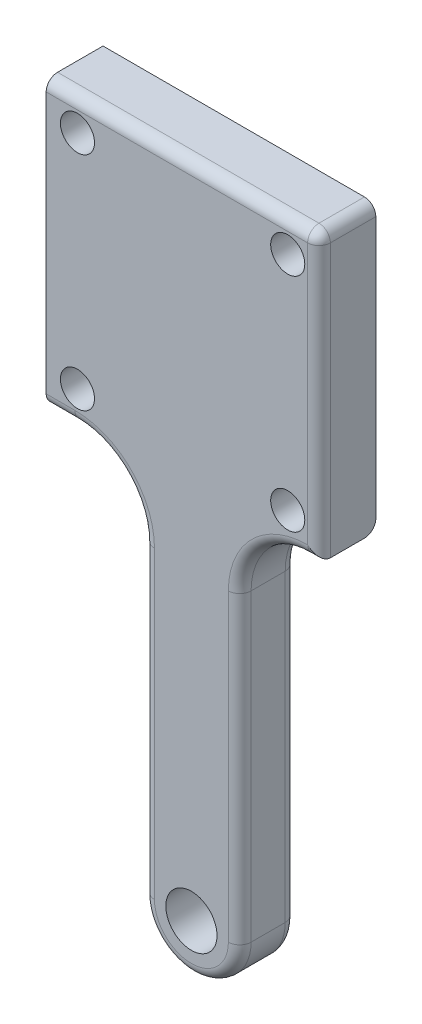
ISO-10303-21;
HEADER;
FILE_DESCRIPTION(('STEP AP214'),'2;1');
FILE_NAME('part.step','',(''),(''),'','','');
FILE_SCHEMA(('AUTOMOTIVE_DESIGN { 1 0 10303 214 1 1 1 1 }'));
ENDSEC;
DATA;
#1=APPLICATION_CONTEXT('core data for automotive mechanical design processes');
#2=APPLICATION_PROTOCOL_DEFINITION('international standard','automotive_design',2000,#1);
#3=PRODUCT_CONTEXT('',#1,'mechanical');
#4=PRODUCT('Part','Part','',(#3));
#5=PRODUCT_RELATED_PRODUCT_CATEGORY('part','',(#4));
#6=PRODUCT_DEFINITION_FORMATION('','',#4);
#7=PRODUCT_DEFINITION_CONTEXT('part definition',#1,'design');
#8=PRODUCT_DEFINITION('design','',#6,#7);
#9=PRODUCT_DEFINITION_SHAPE('','',#8);
#10=(LENGTH_UNIT() NAMED_UNIT(*) SI_UNIT(.MILLI.,.METRE.));
#11=(NAMED_UNIT(*) PLANE_ANGLE_UNIT() SI_UNIT($,.RADIAN.));
#12=(NAMED_UNIT(*) SI_UNIT($,.STERADIAN.) SOLID_ANGLE_UNIT());
#13=UNCERTAINTY_MEASURE_WITH_UNIT(LENGTH_MEASURE(1.E-05),#10,'distance_accuracy_value','');
#14=(GEOMETRIC_REPRESENTATION_CONTEXT(3) GLOBAL_UNCERTAINTY_ASSIGNED_CONTEXT((#13)) GLOBAL_UNIT_ASSIGNED_CONTEXT((#10,
#11,#12)) REPRESENTATION_CONTEXT('',''));
#15=CARTESIAN_POINT('',(0.,0.,0.));
#16=DIRECTION('',(0.,0.,1.));
#17=DIRECTION('',(1.,0.,0.));
#18=AXIS2_PLACEMENT_3D('',#15,#16,#17);
#19=CARTESIAN_POINT('',(20.9277611445584,10.0126169361447,5.));
#20=DIRECTION('',(0.,0.,-1.));
#21=DIRECTION('',(-1.,0.,0.));
#22=AXIS2_PLACEMENT_3D('',#19,#20,#21);
#23=PLANE('',#22);
#24=DIRECTION('',(0.,1.,0.));
#25=VECTOR('',#24,1.);
#26=CARTESIAN_POINT('',(20.8999999999998,10.0126169361447,5.));
#27=LINE('',#26,#25);
#28=CARTESIAN_POINT('',(20.8999999999998,17.0125618872748,5.));
#29=VERTEX_POINT('',#28);
#30=CARTESIAN_POINT('',(20.8999999999998,40.0126169361447,5.));
#31=VERTEX_POINT('',#30);
#32=EDGE_CURVE('E188',#29,#31,#27,.T.);
#33=ORIENTED_EDGE('',*,*,#32,.T.);
#34=DIRECTION('',(-1.,0.,0.));
#35=VECTOR('',#34,1.);
#36=CARTESIAN_POINT('',(20.9277611445584,40.0126169361447,5.));
#37=LINE('',#36,#35);
#38=CARTESIAN_POINT('',(-2.10000000000015,40.0126169361447,5.));
#39=VERTEX_POINT('',#38);
#40=EDGE_CURVE('E345',#31,#39,#37,.T.);
#41=ORIENTED_EDGE('',*,*,#40,.T.);
#42=DIRECTION('',(0.,-1.,0.));
#43=VECTOR('',#42,1.);
#44=CARTESIAN_POINT('',(-2.10000000000015,16.0126169361447,5.));
#45=LINE('',#44,#43);
#46=CARTESIAN_POINT('',(-2.10000000000015,17.0126169361447,5.));
#47=VERTEX_POINT('',#46);
#48=EDGE_CURVE('E494',#39,#47,#45,.T.);
#49=ORIENTED_EDGE('',*,*,#48,.T.);
#50=DIRECTION('',(1.,0.,0.));
#51=VECTOR('',#50,1.);
#52=CARTESIAN_POINT('',(20.9277611445584,17.0126169361447,5.));
#53=LINE('',#52,#51);
#54=CARTESIAN_POINT('',(0.427761144558368,17.0126169361447,5.));
#55=VERTEX_POINT('',#54);
#56=EDGE_CURVE('E336',#47,#55,#53,.T.);
#57=ORIENTED_EDGE('',*,*,#56,.T.);
#58=CARTESIAN_POINT('',(0.427761144558411,10.0126169361447,5.));
#59=DIRECTION('',(0.,0.,-1.));
#60=DIRECTION('',(-1.,0.,0.));
#61=AXIS2_PLACEMENT_3D('',#58,#59,#60);
#62=CIRCLE('',#61,7.);
#63=CARTESIAN_POINT('',(7.42776114455841,10.0126169361446,5.));
#64=VERTEX_POINT('',#63);
#65=EDGE_CURVE('E334',#55,#64,#62,.T.);
#66=ORIENTED_EDGE('',*,*,#65,.T.);
#67=DIRECTION('',(0.,-1.,0.));
#68=VECTOR('',#67,1.);
#69=CARTESIAN_POINT('',(7.42776114455841,10.0126169361447,5.));
#70=LINE('',#69,#68);
#71=CARTESIAN_POINT('',(7.42776114455841,-16.7514672059893,5.));
#72=VERTEX_POINT('',#71);
#73=EDGE_CURVE('E396',#64,#72,#70,.T.);
#74=ORIENTED_EDGE('',*,*,#73,.T.);
#75=CARTESIAN_POINT('',(10.6777611445584,-16.7514672059893,5.));
#76=DIRECTION('',(0.,0.,-1.));
#77=DIRECTION('',(-1.,0.,0.));
#78=AXIS2_PLACEMENT_3D('',#75,#76,#77);
#79=CIRCLE('',#78,3.25);
#80=CARTESIAN_POINT('',(13.9277611445584,-16.7514672059893,5.));
#81=VERTEX_POINT('',#80);
#82=EDGE_CURVE('E338',#72,#81,#79,.F.);
#83=ORIENTED_EDGE('',*,*,#82,.T.);
#84=DIRECTION('',(0.,1.,0.));
#85=VECTOR('',#84,1.);
#86=CARTESIAN_POINT('',(13.9277611445584,10.0126169361447,5.));
#87=LINE('',#86,#85);
#88=CARTESIAN_POINT('',(13.9277611445584,10.0126169361446,5.));
#89=VERTEX_POINT('',#88);
#90=EDGE_CURVE('E330',#81,#89,#87,.T.);
#91=ORIENTED_EDGE('',*,*,#90,.T.);
#92=CARTESIAN_POINT('',(20.9277611445584,10.0126169361447,5.));
#93=DIRECTION('',(0.,0.,-1.));
#94=DIRECTION('',(-1.,0.,0.));
#95=AXIS2_PLACEMENT_3D('',#92,#93,#94);
#96=CIRCLE('',#95,7.);
#97=EDGE_CURVE('E333',#89,#29,#96,.T.);
#98=ORIENTED_EDGE('',*,*,#97,.T.);
#99=EDGE_LOOP('',(#33,#41,#49,#57,#66,#74,#83,#91,#98));
#100=FACE_BOUND('',#99,.T.);
#101=CARTESIAN_POINT('',(10.6777611445584,-16.7514672059893,5.));
#102=DIRECTION('',(0.,0.,1.));
#103=DIRECTION('',(1.,0.,0.));
#104=AXIS2_PLACEMENT_3D('',#101,#102,#103);
#105=CIRCLE('',#104,2.25);
#106=CARTESIAN_POINT('',(12.9277611445584,-16.7514672059893,5.));
#107=VERTEX_POINT('',#106);
#108=EDGE_CURVE('E485',#107,#107,#105,.T.);
#109=ORIENTED_EDGE('',*,*,#108,.F.);
#110=EDGE_LOOP('',(#109));
#111=FACE_BOUND('',#110,.T.);
#112=CARTESIAN_POINT('',(0.649999999999856,38.2626169361447,5.));
#113=DIRECTION('',(0.,0.,1.));
#114=DIRECTION('',(1.,0.,0.));
#115=AXIS2_PLACEMENT_3D('',#112,#113,#114);
#116=CIRCLE('',#115,1.5);
#117=CARTESIAN_POINT('',(2.14999999999986,38.2626169361447,5.));
#118=VERTEX_POINT('',#117);
#119=EDGE_CURVE('E527',#118,#118,#116,.T.);
#120=ORIENTED_EDGE('',*,*,#119,.F.);
#121=EDGE_LOOP('',(#120));
#122=FACE_BOUND('',#121,.T.);
#123=CARTESIAN_POINT('',(19.1499999999999,38.2626169361447,5.));
#124=DIRECTION('',(0.,0.,1.));
#125=DIRECTION('',(1.,0.,0.));
#126=AXIS2_PLACEMENT_3D('',#123,#124,#125);
#127=CIRCLE('',#126,1.5);
#128=CARTESIAN_POINT('',(20.6499999999999,38.2626169361447,5.));
#129=VERTEX_POINT('',#128);
#130=EDGE_CURVE('E532',#129,#129,#127,.T.);
#131=ORIENTED_EDGE('',*,*,#130,.F.);
#132=EDGE_LOOP('',(#131));
#133=FACE_BOUND('',#132,.T.);
#134=CARTESIAN_POINT('',(19.1499999999999,18.7626169361446,5.));
#135=DIRECTION('',(0.,0.,1.));
#136=DIRECTION('',(1.,0.,0.));
#137=AXIS2_PLACEMENT_3D('',#134,#135,#136);
#138=CIRCLE('',#137,1.5);
#139=CARTESIAN_POINT('',(20.6499999999999,18.7626169361446,5.));
#140=VERTEX_POINT('',#139);
#141=EDGE_CURVE('E538',#140,#140,#138,.T.);
#142=ORIENTED_EDGE('',*,*,#141,.F.);
#143=EDGE_LOOP('',(#142));
#144=FACE_BOUND('',#143,.T.);
#145=CARTESIAN_POINT('',(0.649999999999856,18.7626169361446,5.));
#146=DIRECTION('',(0.,0.,1.));
#147=DIRECTION('',(1.,0.,0.));
#148=AXIS2_PLACEMENT_3D('',#145,#146,#147);
#149=CIRCLE('',#148,1.5);
#150=CARTESIAN_POINT('',(2.14999999999986,18.7626169361446,5.));
#151=VERTEX_POINT('',#150);
#152=EDGE_CURVE('E544',#151,#151,#149,.T.);
#153=ORIENTED_EDGE('',*,*,#152,.F.);
#154=EDGE_LOOP('',(#153));
#155=FACE_BOUND('',#154,.T.);
#156=ADVANCED_FACE('F33',(#100,#111,#122,#133,#144,#155),#23,.F.);
#157=CARTESIAN_POINT('',(20.9277611445584,10.0126169361447,0.));
#158=DIRECTION('',(0.,0.,-1.));
#159=DIRECTION('',(-1.,0.,0.));
#160=AXIS2_PLACEMENT_3D('',#157,#158,#159);
#161=PLANE('',#160);
#162=CARTESIAN_POINT('',(19.1499999999999,18.7626169361446,0.));
#163=DIRECTION('',(0.,0.,1.));
#164=DIRECTION('',(1.,0.,0.));
#165=AXIS2_PLACEMENT_3D('',#162,#163,#164);
#166=CIRCLE('',#165,1.5);
#167=CARTESIAN_POINT('',(20.6499999999999,18.7626169361446,0.));
#168=VERTEX_POINT('',#167);
#169=EDGE_CURVE('E541',#168,#168,#166,.T.);
#170=ORIENTED_EDGE('',*,*,#169,.T.);
#171=EDGE_LOOP('',(#170));
#172=FACE_BOUND('',#171,.T.);
#173=CARTESIAN_POINT('',(0.649999999999856,38.2626169361447,0.));
#174=DIRECTION('',(0.,0.,1.));
#175=DIRECTION('',(1.,0.,0.));
#176=AXIS2_PLACEMENT_3D('',#173,#174,#175);
#177=CIRCLE('',#176,1.5);
#178=CARTESIAN_POINT('',(2.14999999999986,38.2626169361447,0.));
#179=VERTEX_POINT('',#178);
#180=EDGE_CURVE('E529',#179,#179,#177,.T.);
#181=ORIENTED_EDGE('',*,*,#180,.T.);
#182=EDGE_LOOP('',(#181));
#183=FACE_BOUND('',#182,.T.);
#184=CARTESIAN_POINT('',(0.427761144558411,10.0126169361447,0.));
#185=DIRECTION('',(0.,0.,-1.));
#186=DIRECTION('',(-1.,0.,0.));
#187=AXIS2_PLACEMENT_3D('',#184,#185,#186);
#188=CIRCLE('',#187,7.);
#189=CARTESIAN_POINT('',(7.42776114455841,10.0126169361446,0.));
#190=VERTEX_POINT('',#189);
#191=CARTESIAN_POINT('',(0.427761144558368,17.0126169361447,0.));
#192=VERTEX_POINT('',#191);
#193=EDGE_CURVE('E426',#190,#192,#188,.F.);
#194=ORIENTED_EDGE('',*,*,#193,.T.);
#195=DIRECTION('',(1.,0.,0.));
#196=VECTOR('',#195,1.);
#197=CARTESIAN_POINT('',(-2.10000000000015,17.0126169361447,0.));
#198=LINE('',#197,#196);
#199=CARTESIAN_POINT('',(-2.10000000000015,17.0126169361447,0.));
#200=VERTEX_POINT('',#199);
#201=EDGE_CURVE('E438',#192,#200,#198,.F.);
#202=ORIENTED_EDGE('',*,*,#201,.T.);
#203=DIRECTION('',(0.,-1.,0.));
#204=VECTOR('',#203,1.);
#205=CARTESIAN_POINT('',(-2.10000000000015,16.0126169361447,0.));
#206=LINE('',#205,#204);
#207=CARTESIAN_POINT('',(-2.10000000000015,41.0126169361447,0.));
#208=VERTEX_POINT('',#207);
#209=EDGE_CURVE('E482',#208,#200,#206,.T.);
#210=ORIENTED_EDGE('',*,*,#209,.F.);
#211=DIRECTION('',(-1.,0.,0.));
#212=VECTOR('',#211,1.);
#213=CARTESIAN_POINT('',(-2.10000000000015,41.0126169361447,0.));
#214=LINE('',#213,#212);
#215=CARTESIAN_POINT('',(20.8999999999998,41.0126169361447,0.));
#216=VERTEX_POINT('',#215);
#217=EDGE_CURVE('E488',#216,#208,#214,.T.);
#218=ORIENTED_EDGE('',*,*,#217,.F.);
#219=CARTESIAN_POINT('',(20.8999999999998,40.0126169361447,0.));
#220=DIRECTION('',(0.,0.,-1.));
#221=DIRECTION('',(-1.,0.,0.));
#222=AXIS2_PLACEMENT_3D('',#219,#220,#221);
#223=CIRCLE('',#222,1.);
#224=CARTESIAN_POINT('',(21.8999999999998,40.0126169361447,0.));
#225=VERTEX_POINT('',#224);
#226=EDGE_CURVE('E421',#216,#225,#223,.T.);
#227=ORIENTED_EDGE('',*,*,#226,.T.);
#228=DIRECTION('',(0.,1.,0.));
#229=VECTOR('',#228,1.);
#230=CARTESIAN_POINT('',(21.8999999999998,41.0126169361447,0.));
#231=LINE('',#230,#229);
#232=CARTESIAN_POINT('',(21.8999999999998,17.0126169361447,0.));
#233=VERTEX_POINT('',#232);
#234=EDGE_CURVE('E484',#233,#225,#231,.T.);
#235=ORIENTED_EDGE('',*,*,#234,.F.);
#236=DIRECTION('',(1.,0.,0.));
#237=VECTOR('',#236,1.);
#238=CARTESIAN_POINT('',(20.9277611445585,17.0126169361447,0.));
#239=LINE('',#238,#237);
#240=CARTESIAN_POINT('',(20.9277611445585,17.0126169361447,0.));
#241=VERTEX_POINT('',#240);
#242=EDGE_CURVE('E436',#233,#241,#239,.F.);
#243=ORIENTED_EDGE('',*,*,#242,.T.);
#244=CARTESIAN_POINT('',(20.9277611445584,10.0126169361447,0.));
#245=DIRECTION('',(0.,0.,-1.));
#246=DIRECTION('',(-1.,0.,0.));
#247=AXIS2_PLACEMENT_3D('',#244,#245,#246);
#248=CIRCLE('',#247,7.);
#249=CARTESIAN_POINT('',(13.9277611445584,10.0126169361446,0.));
#250=VERTEX_POINT('',#249);
#251=EDGE_CURVE('E434',#241,#250,#248,.F.);
#252=ORIENTED_EDGE('',*,*,#251,.T.);
#253=DIRECTION('',(0.,1.,0.));
#254=VECTOR('',#253,1.);
#255=CARTESIAN_POINT('',(13.9277611445584,-16.7514672059893,0.));
#256=LINE('',#255,#254);
#257=CARTESIAN_POINT('',(13.9277611445584,-16.7514672059893,0.));
#258=VERTEX_POINT('',#257);
#259=EDGE_CURVE('E432',#250,#258,#256,.F.);
#260=ORIENTED_EDGE('',*,*,#259,.T.);
#261=CARTESIAN_POINT('',(10.6777611445584,-16.7514672059893,0.));
#262=DIRECTION('',(0.,0.,-1.));
#263=DIRECTION('',(-1.,0.,0.));
#264=AXIS2_PLACEMENT_3D('',#261,#262,#263);
#265=CIRCLE('',#264,3.25);
#266=CARTESIAN_POINT('',(7.42776114455841,-16.7514672059893,0.));
#267=VERTEX_POINT('',#266);
#268=EDGE_CURVE('E430',#258,#267,#265,.T.);
#269=ORIENTED_EDGE('',*,*,#268,.T.);
#270=DIRECTION('',(0.,-1.,0.));
#271=VECTOR('',#270,1.);
#272=CARTESIAN_POINT('',(7.42776114455841,10.0126169361446,0.));
#273=LINE('',#272,#271);
#274=EDGE_CURVE('E428',#267,#190,#273,.F.);
#275=ORIENTED_EDGE('',*,*,#274,.T.);
#276=EDGE_LOOP('',(#194,#202,#210,#218,#227,#235,#243,#252,#260,#269,#275));
#277=FACE_BOUND('',#276,.T.);
#278=CARTESIAN_POINT('',(10.6777611445584,-16.7514672059893,0.));
#279=DIRECTION('',(0.,0.,1.));
#280=DIRECTION('',(1.,0.,0.));
#281=AXIS2_PLACEMENT_3D('',#278,#279,#280);
#282=CIRCLE('',#281,2.25);
#283=CARTESIAN_POINT('',(12.9277611445584,-16.7514672059893,0.));
#284=VERTEX_POINT('',#283);
#285=EDGE_CURVE('E491',#284,#284,#282,.T.);
#286=ORIENTED_EDGE('',*,*,#285,.T.);
#287=EDGE_LOOP('',(#286));
#288=FACE_BOUND('',#287,.T.);
#289=CARTESIAN_POINT('',(19.1499999999999,38.2626169361447,0.));
#290=DIRECTION('',(0.,0.,1.));
#291=DIRECTION('',(1.,0.,0.));
#292=AXIS2_PLACEMENT_3D('',#289,#290,#291);
#293=CIRCLE('',#292,1.5);
#294=CARTESIAN_POINT('',(20.6499999999999,38.2626169361447,0.));
#295=VERTEX_POINT('',#294);
#296=EDGE_CURVE('E535',#295,#295,#293,.T.);
#297=ORIENTED_EDGE('',*,*,#296,.T.);
#298=EDGE_LOOP('',(#297));
#299=FACE_BOUND('',#298,.T.);
#300=CARTESIAN_POINT('',(0.649999999999856,18.7626169361446,0.));
#301=DIRECTION('',(0.,0.,1.));
#302=DIRECTION('',(1.,0.,0.));
#303=AXIS2_PLACEMENT_3D('',#300,#301,#302);
#304=CIRCLE('',#303,1.5);
#305=CARTESIAN_POINT('',(2.14999999999986,18.7626169361446,0.));
#306=VERTEX_POINT('',#305);
#307=EDGE_CURVE('E369',#306,#306,#304,.T.);
#308=ORIENTED_EDGE('',*,*,#307,.T.);
#309=EDGE_LOOP('',(#308));
#310=FACE_BOUND('',#309,.T.);
#311=ADVANCED_FACE('F227',(#172,#183,#277,#288,#299,#310),#161,.T.);
#312=CARTESIAN_POINT('',(-2.10000000000015,16.0126169361447,5.));
#313=DIRECTION('',(1.,0.,0.));
#314=DIRECTION('',(0.,1.,0.));
#315=AXIS2_PLACEMENT_3D('',#312,#313,#314);
#316=PLANE('',#315);
#317=ORIENTED_EDGE('',*,*,#209,.T.);
#318=CARTESIAN_POINT('',(-2.10000000000015,17.0126169361447,1.));
#319=DIRECTION('',(1.,0.,0.));
#320=DIRECTION('',(0.,1.,0.));
#321=AXIS2_PLACEMENT_3D('',#318,#319,#320);
#322=CIRCLE('',#321,1.);
#323=CARTESIAN_POINT('',(-2.10000000000015,16.0126169361447,1.));
#324=VERTEX_POINT('',#323);
#325=EDGE_CURVE('E443',#200,#324,#322,.F.);
#326=ORIENTED_EDGE('',*,*,#325,.T.);
#327=DIRECTION('',(0.,0.,-1.));
#328=VECTOR('',#327,1.);
#329=CARTESIAN_POINT('',(-2.10000000000015,16.0126169361447,5.));
#330=LINE('',#329,#328);
#331=CARTESIAN_POINT('',(-2.10000000000015,16.0126169361447,4.));
#332=VERTEX_POINT('',#331);
#333=EDGE_CURVE('E415',#332,#324,#330,.T.);
#334=ORIENTED_EDGE('',*,*,#333,.F.);
#335=CARTESIAN_POINT('',(-2.10000000000015,17.0126169361447,4.));
#336=DIRECTION('',(1.,0.,0.));
#337=DIRECTION('',(0.,1.,0.));
#338=AXIS2_PLACEMENT_3D('',#335,#336,#337);
#339=CIRCLE('',#338,1.);
#340=EDGE_CURVE('E419',#332,#47,#339,.F.);
#341=ORIENTED_EDGE('',*,*,#340,.T.);
#342=ORIENTED_EDGE('',*,*,#48,.F.);
#343=CARTESIAN_POINT('',(-2.10000000000015,40.0126169361447,4.));
#344=DIRECTION('',(1.,0.,0.));
#345=DIRECTION('',(0.,1.,0.));
#346=AXIS2_PLACEMENT_3D('',#343,#344,#345);
#347=CIRCLE('',#346,1.);
#348=CARTESIAN_POINT('',(-2.10000000000015,41.0126169361447,4.));
#349=VERTEX_POINT('',#348);
#350=EDGE_CURVE('E440',#39,#349,#347,.F.);
#351=ORIENTED_EDGE('',*,*,#350,.T.);
#352=DIRECTION('',(0.,0.,-1.));
#353=VECTOR('',#352,1.);
#354=CARTESIAN_POINT('',(-2.10000000000015,41.0126169361447,5.));
#355=LINE('',#354,#353);
#356=EDGE_CURVE('E165',#349,#208,#355,.T.);
#357=ORIENTED_EDGE('',*,*,#356,.T.);
#358=EDGE_LOOP('',(#317,#326,#334,#341,#342,#351,#357));
#359=FACE_BOUND('',#358,.T.);
#360=ADVANCED_FACE('F233',(#359),#316,.F.);
#361=CARTESIAN_POINT('',(-2.10000000000015,16.0126169361447,5.));
#362=DIRECTION('',(0.,1.,0.));
#363=DIRECTION('',(0.,0.,1.));
#364=AXIS2_PLACEMENT_3D('',#361,#362,#363);
#365=PLANE('',#364);
#366=ORIENTED_EDGE('',*,*,#333,.T.);
#367=DIRECTION('',(1.,0.,0.));
#368=VECTOR('',#367,1.);
#369=CARTESIAN_POINT('',(0.427761144558368,16.0126169361447,1.));
#370=LINE('',#369,#368);
#371=CARTESIAN_POINT('',(0.427761144558368,16.0126169361447,1.));
#372=VERTEX_POINT('',#371);
#373=EDGE_CURVE('E414',#324,#372,#370,.T.);
#374=ORIENTED_EDGE('',*,*,#373,.T.);
#375=DIRECTION('',(0.,0.,-1.));
#376=VECTOR('',#375,1.);
#377=CARTESIAN_POINT('',(0.427761144558368,16.0126169361447,5.));
#378=LINE('',#377,#376);
#379=CARTESIAN_POINT('',(0.427761144558368,16.0126169361447,4.));
#380=VERTEX_POINT('',#379);
#381=EDGE_CURVE('E405',#380,#372,#378,.T.);
#382=ORIENTED_EDGE('',*,*,#381,.F.);
#383=DIRECTION('',(1.,0.,0.));
#384=VECTOR('',#383,1.);
#385=CARTESIAN_POINT('',(-2.10000000000015,16.0126169361447,4.));
#386=LINE('',#385,#384);
#387=EDGE_CURVE('E411',#380,#332,#386,.F.);
#388=ORIENTED_EDGE('',*,*,#387,.T.);
#389=EDGE_LOOP('',(#366,#374,#382,#388));
#390=FACE_BOUND('',#389,.T.);
#391=ADVANCED_FACE('F271',(#390),#365,.F.);
#392=CARTESIAN_POINT('',(0.427761144558411,10.0126169361447,5.));
#393=DIRECTION('',(0.,0.,-1.));
#394=DIRECTION('',(-1.,0.,0.));
#395=AXIS2_PLACEMENT_3D('',#392,#393,#394);
#396=CYLINDRICAL_SURFACE('',#395,6.);
#397=DIRECTION('',(0.,0.,-1.));
#398=VECTOR('',#397,1.);
#399=CARTESIAN_POINT('',(6.42776114455841,10.0126169361446,5.));
#400=LINE('',#399,#398);
#401=CARTESIAN_POINT('',(6.42776114455841,10.0126169361446,4.));
#402=VERTEX_POINT('',#401);
#403=CARTESIAN_POINT('',(6.42776114455841,10.0126169361446,1.));
#404=VERTEX_POINT('',#403);
#405=EDGE_CURVE('E407',#402,#404,#400,.T.);
#406=ORIENTED_EDGE('',*,*,#405,.F.);
#407=CARTESIAN_POINT('',(0.427761144558411,10.0126169361447,4.));
#408=DIRECTION('',(0.,0.,-1.));
#409=DIRECTION('',(-1.,0.,0.));
#410=AXIS2_PLACEMENT_3D('',#407,#408,#409);
#411=CIRCLE('',#410,6.);
#412=EDGE_CURVE('E349',#402,#380,#411,.F.);
#413=ORIENTED_EDGE('',*,*,#412,.T.);
#414=ORIENTED_EDGE('',*,*,#381,.T.);
#415=CARTESIAN_POINT('',(0.427761144558411,10.0126169361447,1.));
#416=DIRECTION('',(0.,0.,-1.));
#417=DIRECTION('',(-1.,0.,0.));
#418=AXIS2_PLACEMENT_3D('',#415,#416,#417);
#419=CIRCLE('',#418,6.);
#420=EDGE_CURVE('E347',#372,#404,#419,.T.);
#421=ORIENTED_EDGE('',*,*,#420,.T.);
#422=EDGE_LOOP('',(#406,#413,#414,#421));
#423=FACE_BOUND('',#422,.T.);
#424=ADVANCED_FACE('F267',(#423),#396,.F.);
#425=CARTESIAN_POINT('',(6.42776114455841,-16.7514672059893,5.));
#426=DIRECTION('',(1.,0.,0.));
#427=DIRECTION('',(0.,0.,-1.));
#428=AXIS2_PLACEMENT_3D('',#425,#426,#427);
#429=PLANE('',#428);
#430=ORIENTED_EDGE('',*,*,#405,.T.);
#431=DIRECTION('',(0.,-1.,0.));
#432=VECTOR('',#431,1.);
#433=CARTESIAN_POINT('',(6.42776114455841,-16.7514672059893,1.));
#434=LINE('',#433,#432);
#435=CARTESIAN_POINT('',(6.42776114455841,-16.7514672059893,1.));
#436=VERTEX_POINT('',#435);
#437=EDGE_CURVE('E394',#404,#436,#434,.T.);
#438=ORIENTED_EDGE('',*,*,#437,.T.);
#439=DIRECTION('',(0.,0.,-1.));
#440=VECTOR('',#439,1.);
#441=CARTESIAN_POINT('',(6.42776114455841,-16.7514672059893,5.));
#442=LINE('',#441,#440);
#443=CARTESIAN_POINT('',(6.42776114455841,-16.7514672059893,4.));
#444=VERTEX_POINT('',#443);
#445=EDGE_CURVE('E463',#444,#436,#442,.T.);
#446=ORIENTED_EDGE('',*,*,#445,.F.);
#447=DIRECTION('',(0.,-1.,0.));
#448=VECTOR('',#447,1.);
#449=CARTESIAN_POINT('',(6.42776114455841,-16.7514672059893,4.));
#450=LINE('',#449,#448);
#451=EDGE_CURVE('E388',#444,#402,#450,.F.);
#452=ORIENTED_EDGE('',*,*,#451,.T.);
#453=EDGE_LOOP('',(#430,#438,#446,#452));
#454=FACE_BOUND('',#453,.T.);
#455=ADVANCED_FACE('F263',(#454),#429,.F.);
#456=CARTESIAN_POINT('',(10.6777611445584,-16.7514672059893,5.));
#457=DIRECTION('',(0.,0.,-1.));
#458=DIRECTION('',(-1.,0.,0.));
#459=AXIS2_PLACEMENT_3D('',#456,#457,#458);
#460=CYLINDRICAL_SURFACE('',#459,4.25);
#461=ORIENTED_EDGE('',*,*,#445,.T.);
#462=CARTESIAN_POINT('',(10.6777611445584,-16.7514672059893,1.));
#463=DIRECTION('',(0.,0.,-1.));
#464=DIRECTION('',(-1.,0.,0.));
#465=AXIS2_PLACEMENT_3D('',#462,#463,#464);
#466=CIRCLE('',#465,4.25);
#467=CARTESIAN_POINT('',(14.9277611445584,-16.7514672059893,1.));
#468=VERTEX_POINT('',#467);
#469=EDGE_CURVE('E385',#436,#468,#466,.F.);
#470=ORIENTED_EDGE('',*,*,#469,.T.);
#471=DIRECTION('',(0.,0.,-1.));
#472=VECTOR('',#471,1.);
#473=CARTESIAN_POINT('',(14.9277611445584,-16.7514672059893,5.));
#474=LINE('',#473,#472);
#475=CARTESIAN_POINT('',(14.9277611445584,-16.7514672059893,4.));
#476=VERTEX_POINT('',#475);
#477=EDGE_CURVE('E458',#476,#468,#474,.T.);
#478=ORIENTED_EDGE('',*,*,#477,.F.);
#479=CARTESIAN_POINT('',(10.6777611445584,-16.7514672059893,4.));
#480=DIRECTION('',(0.,0.,-1.));
#481=DIRECTION('',(-1.,0.,0.));
#482=AXIS2_PLACEMENT_3D('',#479,#480,#481);
#483=CIRCLE('',#482,4.25);
#484=EDGE_CURVE('E380',#476,#444,#483,.T.);
#485=ORIENTED_EDGE('',*,*,#484,.T.);
#486=EDGE_LOOP('',(#461,#470,#478,#485));
#487=FACE_BOUND('',#486,.T.);
#488=ADVANCED_FACE('F259',(#487),#460,.T.);
#489=CARTESIAN_POINT('',(14.9277611445584,-16.7514672059893,5.));
#490=DIRECTION('',(-1.,0.,0.));
#491=DIRECTION('',(0.,0.,1.));
#492=AXIS2_PLACEMENT_3D('',#489,#490,#491);
#493=PLANE('',#492);
#494=ORIENTED_EDGE('',*,*,#477,.T.);
#495=DIRECTION('',(0.,1.,0.));
#496=VECTOR('',#495,1.);
#497=CARTESIAN_POINT('',(14.9277611445584,10.0126169361446,1.));
#498=LINE('',#497,#496);
#499=CARTESIAN_POINT('',(14.9277611445584,10.0126169361446,1.));
#500=VERTEX_POINT('',#499);
#501=EDGE_CURVE('E386',#468,#500,#498,.T.);
#502=ORIENTED_EDGE('',*,*,#501,.T.);
#503=DIRECTION('',(0.,0.,-1.));
#504=VECTOR('',#503,1.);
#505=CARTESIAN_POINT('',(14.9277611445584,10.0126169361446,5.));
#506=LINE('',#505,#504);
#507=CARTESIAN_POINT('',(14.9277611445584,10.0126169361446,4.));
#508=VERTEX_POINT('',#507);
#509=EDGE_CURVE('E461',#508,#500,#506,.T.);
#510=ORIENTED_EDGE('',*,*,#509,.F.);
#511=DIRECTION('',(0.,1.,0.));
#512=VECTOR('',#511,1.);
#513=CARTESIAN_POINT('',(14.9277611445584,-16.7514672059893,4.));
#514=LINE('',#513,#512);
#515=EDGE_CURVE('E332',#508,#476,#514,.F.);
#516=ORIENTED_EDGE('',*,*,#515,.T.);
#517=EDGE_LOOP('',(#494,#502,#510,#516));
#518=FACE_BOUND('',#517,.T.);
#519=ADVANCED_FACE('F255',(#518),#493,.F.);
#520=CARTESIAN_POINT('',(20.9277611445584,10.0126169361447,5.));
#521=DIRECTION('',(0.,0.,-1.));
#522=DIRECTION('',(-1.,0.,0.));
#523=AXIS2_PLACEMENT_3D('',#520,#521,#522);
#524=CYLINDRICAL_SURFACE('',#523,6.);
#525=ORIENTED_EDGE('',*,*,#509,.T.);
#526=CARTESIAN_POINT('',(20.9277611445584,10.0126169361447,1.));
#527=DIRECTION('',(0.,0.,-1.));
#528=DIRECTION('',(-1.,0.,0.));
#529=AXIS2_PLACEMENT_3D('',#526,#527,#528);
#530=CIRCLE('',#529,6.);
#531=CARTESIAN_POINT('',(20.9277611445585,16.0126169361447,1.));
#532=VERTEX_POINT('',#531);
#533=EDGE_CURVE('E455',#500,#532,#530,.T.);
#534=ORIENTED_EDGE('',*,*,#533,.T.);
#535=DIRECTION('',(0.,0.,-1.));
#536=VECTOR('',#535,1.);
#537=CARTESIAN_POINT('',(20.9277611445585,16.0126169361447,5.));
#538=LINE('',#537,#536);
#539=CARTESIAN_POINT('',(20.9277611445585,16.0126169361447,4.));
#540=VERTEX_POINT('',#539);
#541=EDGE_CURVE('E466',#540,#532,#538,.T.);
#542=ORIENTED_EDGE('',*,*,#541,.F.);
#543=CARTESIAN_POINT('',(20.9277611445584,10.0126169361447,4.));
#544=DIRECTION('',(0.,0.,-1.));
#545=DIRECTION('',(-1.,0.,0.));
#546=AXIS2_PLACEMENT_3D('',#543,#544,#545);
#547=CIRCLE('',#546,6.);
#548=EDGE_CURVE('E194',#540,#508,#547,.F.);
#549=ORIENTED_EDGE('',*,*,#548,.T.);
#550=EDGE_LOOP('',(#525,#534,#542,#549));
#551=FACE_BOUND('',#550,.T.);
#552=ADVANCED_FACE('F251',(#551),#524,.F.);
#553=CARTESIAN_POINT('',(20.9277611445585,16.0126169361447,5.));
#554=DIRECTION('',(0.,1.,0.));
#555=DIRECTION('',(0.,0.,1.));
#556=AXIS2_PLACEMENT_3D('',#553,#554,#555);
#557=PLANE('',#556);
#558=ORIENTED_EDGE('',*,*,#541,.T.);
#559=DIRECTION('',(1.,0.,0.));
#560=VECTOR('',#559,1.);
#561=CARTESIAN_POINT('',(21.8999999999998,16.0126169361447,1.));
#562=LINE('',#561,#560);
#563=CARTESIAN_POINT('',(21.8999999999998,16.0126169361447,1.));
#564=VERTEX_POINT('',#563);
#565=EDGE_CURVE('E446',#532,#564,#562,.T.);
#566=ORIENTED_EDGE('',*,*,#565,.T.);
#567=DIRECTION('',(0.,0.,-1.));
#568=VECTOR('',#567,1.);
#569=CARTESIAN_POINT('',(21.8999999999998,16.0126169361447,5.));
#570=LINE('',#569,#568);
#571=CARTESIAN_POINT('',(21.8999999999998,16.0126169361447,4.));
#572=VERTEX_POINT('',#571);
#573=EDGE_CURVE('E499',#572,#564,#570,.T.);
#574=ORIENTED_EDGE('',*,*,#573,.F.);
#575=DIRECTION('',(1.,0.,0.));
#576=VECTOR('',#575,1.);
#577=CARTESIAN_POINT('',(20.9277611445585,16.0126169361447,4.));
#578=LINE('',#577,#576);
#579=EDGE_CURVE('E178',#572,#540,#578,.F.);
#580=ORIENTED_EDGE('',*,*,#579,.T.);
#581=EDGE_LOOP('',(#558,#566,#574,#580));
#582=FACE_BOUND('',#581,.T.);
#583=ADVANCED_FACE('F247',(#582),#557,.F.);
#584=CARTESIAN_POINT('',(21.8999999999998,41.0126169361447,5.));
#585=DIRECTION('',(-1.,0.,0.));
#586=DIRECTION('',(0.,0.,1.));
#587=AXIS2_PLACEMENT_3D('',#584,#585,#586);
#588=PLANE('',#587);
#589=ORIENTED_EDGE('',*,*,#573,.T.);
#590=CARTESIAN_POINT('',(21.8999999999998,17.0126169361447,1.));
#591=DIRECTION('',(-1.,0.,0.));
#592=DIRECTION('',(0.,0.,1.));
#593=AXIS2_PLACEMENT_3D('',#590,#591,#592);
#594=CIRCLE('',#593,1.);
#595=EDGE_CURVE('E452',#564,#233,#594,.F.);
#596=ORIENTED_EDGE('',*,*,#595,.T.);
#597=ORIENTED_EDGE('',*,*,#234,.T.);
#598=DIRECTION('',(0.,0.,-1.));
#599=VECTOR('',#598,1.);
#600=CARTESIAN_POINT('',(21.8999999999998,40.0126169361447,5.));
#601=LINE('',#600,#599);
#602=CARTESIAN_POINT('',(21.8999999999998,40.0126169361447,4.));
#603=VERTEX_POINT('',#602);
#604=EDGE_CURVE('E450',#225,#603,#601,.F.);
#605=ORIENTED_EDGE('',*,*,#604,.T.);
#606=DIRECTION('',(0.,1.,0.));
#607=VECTOR('',#606,1.);
#608=CARTESIAN_POINT('',(21.8999999999998,41.0126169361447,4.));
#609=LINE('',#608,#607);
#610=EDGE_CURVE('E448',#603,#572,#609,.F.);
#611=ORIENTED_EDGE('',*,*,#610,.T.);
#612=EDGE_LOOP('',(#589,#596,#597,#605,#611));
#613=FACE_BOUND('',#612,.T.);
#614=ADVANCED_FACE('F244',(#613),#588,.F.);
#615=CARTESIAN_POINT('',(-2.10000000000015,41.0126169361447,5.));
#616=DIRECTION('',(0.,-1.,0.));
#617=DIRECTION('',(1.,0.,0.));
#618=AXIS2_PLACEMENT_3D('',#615,#616,#617);
#619=PLANE('',#618);
#620=DIRECTION('',(-1.,0.,0.));
#621=VECTOR('',#620,1.);
#622=CARTESIAN_POINT('',(-2.10000000000015,41.0126169361447,4.));
#623=LINE('',#622,#621);
#624=CARTESIAN_POINT('',(20.8999999999998,41.0126169361447,4.));
#625=VERTEX_POINT('',#624);
#626=EDGE_CURVE('E43',#349,#625,#623,.F.);
#627=ORIENTED_EDGE('',*,*,#626,.T.);
#628=DIRECTION('',(0.,0.,-1.));
#629=VECTOR('',#628,1.);
#630=CARTESIAN_POINT('',(20.8999999999998,41.0126169361447,5.));
#631=LINE('',#630,#629);
#632=EDGE_CURVE('E11',#625,#216,#631,.T.);
#633=ORIENTED_EDGE('',*,*,#632,.T.);
#634=ORIENTED_EDGE('',*,*,#217,.T.);
#635=ORIENTED_EDGE('',*,*,#356,.F.);
#636=EDGE_LOOP('',(#627,#633,#634,#635));
#637=FACE_BOUND('',#636,.T.);
#638=ADVANCED_FACE('F241',(#637),#619,.F.);
#639=CARTESIAN_POINT('',(10.6777611445584,-16.7514672059893,5.));
#640=DIRECTION('',(0.,0.,-1.));
#641=DIRECTION('',(-1.,0.,0.));
#642=AXIS2_PLACEMENT_3D('',#639,#640,#641);
#643=CYLINDRICAL_SURFACE('',#642,2.25);
#644=ORIENTED_EDGE('',*,*,#108,.T.);
#645=EDGE_LOOP('',(#644));
#646=FACE_BOUND('',#645,.T.);
#647=ORIENTED_EDGE('',*,*,#285,.F.);
#648=EDGE_LOOP('',(#647));
#649=FACE_BOUND('',#648,.T.);
#650=ADVANCED_FACE('F238',(#646,#649),#643,.F.);
#651=CARTESIAN_POINT('',(0.649999999999856,38.2626169361447,5.));
#652=DIRECTION('',(0.,0.,-1.));
#653=DIRECTION('',(-1.,0.,0.));
#654=AXIS2_PLACEMENT_3D('',#651,#652,#653);
#655=CYLINDRICAL_SURFACE('',#654,1.5);
#656=ORIENTED_EDGE('',*,*,#119,.T.);
#657=EDGE_LOOP('',(#656));
#658=FACE_BOUND('',#657,.T.);
#659=ORIENTED_EDGE('',*,*,#180,.F.);
#660=EDGE_LOOP('',(#659));
#661=FACE_BOUND('',#660,.T.);
#662=ADVANCED_FACE('F567',(#658,#661),#655,.F.);
#663=CARTESIAN_POINT('',(19.1499999999999,38.2626169361447,5.));
#664=DIRECTION('',(0.,0.,-1.));
#665=DIRECTION('',(-1.,0.,0.));
#666=AXIS2_PLACEMENT_3D('',#663,#664,#665);
#667=CYLINDRICAL_SURFACE('',#666,1.5);
#668=ORIENTED_EDGE('',*,*,#130,.T.);
#669=EDGE_LOOP('',(#668));
#670=FACE_BOUND('',#669,.T.);
#671=ORIENTED_EDGE('',*,*,#296,.F.);
#672=EDGE_LOOP('',(#671));
#673=FACE_BOUND('',#672,.T.);
#674=ADVANCED_FACE('F562',(#670,#673),#667,.F.);
#675=CARTESIAN_POINT('',(19.1499999999999,18.7626169361446,5.));
#676=DIRECTION('',(0.,0.,-1.));
#677=DIRECTION('',(-1.,0.,0.));
#678=AXIS2_PLACEMENT_3D('',#675,#676,#677);
#679=CYLINDRICAL_SURFACE('',#678,1.5);
#680=ORIENTED_EDGE('',*,*,#141,.T.);
#681=EDGE_LOOP('',(#680));
#682=FACE_BOUND('',#681,.T.);
#683=ORIENTED_EDGE('',*,*,#169,.F.);
#684=EDGE_LOOP('',(#683));
#685=FACE_BOUND('',#684,.T.);
#686=ADVANCED_FACE('F555',(#682,#685),#679,.F.);
#687=CARTESIAN_POINT('',(0.649999999999856,18.7626169361446,5.));
#688=DIRECTION('',(0.,0.,-1.));
#689=DIRECTION('',(-1.,0.,0.));
#690=AXIS2_PLACEMENT_3D('',#687,#688,#689);
#691=CYLINDRICAL_SURFACE('',#690,1.5);
#692=ORIENTED_EDGE('',*,*,#152,.T.);
#693=EDGE_LOOP('',(#692));
#694=FACE_BOUND('',#693,.T.);
#695=ORIENTED_EDGE('',*,*,#307,.F.);
#696=EDGE_LOOP('',(#695));
#697=FACE_BOUND('',#696,.T.);
#698=ADVANCED_FACE('F304',(#694,#697),#691,.F.);
#699=CARTESIAN_POINT('',(20.9277611445585,17.0126169361447,1.));
#700=DIRECTION('',(-1.,0.,0.));
#701=DIRECTION('',(0.,0.,1.));
#702=AXIS2_PLACEMENT_3D('',#699,#700,#701);
#703=CYLINDRICAL_SURFACE('',#702,1.);
#704=ORIENTED_EDGE('',*,*,#595,.F.);
#705=ORIENTED_EDGE('',*,*,#565,.F.);
#706=CARTESIAN_POINT('',(20.9277611445585,17.0126169361447,1.));
#707=DIRECTION('',(-1.,0.,0.));
#708=DIRECTION('',(0.,0.,1.));
#709=AXIS2_PLACEMENT_3D('',#706,#707,#708);
#710=CIRCLE('',#709,1.);
#711=EDGE_CURVE('E366',#241,#532,#710,.T.);
#712=ORIENTED_EDGE('',*,*,#711,.F.);
#713=ORIENTED_EDGE('',*,*,#242,.F.);
#714=EDGE_LOOP('',(#704,#705,#712,#713));
#715=FACE_BOUND('',#714,.T.);
#716=ADVANCED_FACE('F300',(#715),#703,.T.);
#717=CARTESIAN_POINT('',(20.9277611445584,10.0126169361447,1.));
#718=DIRECTION('',(0.,0.,-1.));
#719=DIRECTION('',(-1.,0.,0.));
#720=AXIS2_PLACEMENT_3D('',#717,#718,#719);
#721=TOROIDAL_SURFACE('',#720,7.,1.);
#722=ORIENTED_EDGE('',*,*,#711,.T.);
#723=ORIENTED_EDGE('',*,*,#533,.F.);
#724=CARTESIAN_POINT('',(13.9277611445584,10.0126169361446,1.));
#725=DIRECTION('',(0.,-1.,0.));
#726=DIRECTION('',(1.,0.,0.));
#727=AXIS2_PLACEMENT_3D('',#724,#725,#726);
#728=CIRCLE('',#727,1.);
#729=EDGE_CURVE('E363',#250,#500,#728,.T.);
#730=ORIENTED_EDGE('',*,*,#729,.F.);
#731=ORIENTED_EDGE('',*,*,#251,.F.);
#732=EDGE_LOOP('',(#722,#723,#730,#731));
#733=FACE_BOUND('',#732,.T.);
#734=ADVANCED_FACE('F296',(#733),#721,.T.);
#735=CARTESIAN_POINT('',(13.9277611445584,-16.7514672059893,1.));
#736=DIRECTION('',(0.,-1.,0.));
#737=DIRECTION('',(0.,0.,-1.));
#738=AXIS2_PLACEMENT_3D('',#735,#736,#737);
#739=CYLINDRICAL_SURFACE('',#738,1.);
#740=ORIENTED_EDGE('',*,*,#729,.T.);
#741=ORIENTED_EDGE('',*,*,#501,.F.);
#742=CARTESIAN_POINT('',(13.9277611445584,-16.7514672059893,1.));
#743=DIRECTION('',(0.,-1.,0.));
#744=DIRECTION('',(0.,0.,-1.));
#745=AXIS2_PLACEMENT_3D('',#742,#743,#744);
#746=CIRCLE('',#745,1.);
#747=EDGE_CURVE('E360',#258,#468,#746,.T.);
#748=ORIENTED_EDGE('',*,*,#747,.F.);
#749=ORIENTED_EDGE('',*,*,#259,.F.);
#750=EDGE_LOOP('',(#740,#741,#748,#749));
#751=FACE_BOUND('',#750,.T.);
#752=ADVANCED_FACE('F292',(#751),#739,.T.);
#753=CARTESIAN_POINT('',(10.6777611445584,-16.7514672059893,1.));
#754=DIRECTION('',(0.,0.,-1.));
#755=DIRECTION('',(-1.,0.,0.));
#756=AXIS2_PLACEMENT_3D('',#753,#754,#755);
#757=TOROIDAL_SURFACE('',#756,3.25,1.);
#758=ORIENTED_EDGE('',*,*,#747,.T.);
#759=ORIENTED_EDGE('',*,*,#469,.F.);
#760=CARTESIAN_POINT('',(7.42776114455841,-16.7514672059893,1.));
#761=DIRECTION('',(0.,1.,0.));
#762=DIRECTION('',(0.,0.,1.));
#763=AXIS2_PLACEMENT_3D('',#760,#761,#762);
#764=CIRCLE('',#763,1.);
#765=EDGE_CURVE('E357',#267,#436,#764,.T.);
#766=ORIENTED_EDGE('',*,*,#765,.F.);
#767=ORIENTED_EDGE('',*,*,#268,.F.);
#768=EDGE_LOOP('',(#758,#759,#766,#767));
#769=FACE_BOUND('',#768,.T.);
#770=ADVANCED_FACE('F288',(#769),#757,.T.);
#771=CARTESIAN_POINT('',(7.42776114455841,-16.7514672059893,1.));
#772=DIRECTION('',(0.,1.,0.));
#773=DIRECTION('',(0.,0.,1.));
#774=AXIS2_PLACEMENT_3D('',#771,#772,#773);
#775=CYLINDRICAL_SURFACE('',#774,1.);
#776=ORIENTED_EDGE('',*,*,#765,.T.);
#777=ORIENTED_EDGE('',*,*,#437,.F.);
#778=CARTESIAN_POINT('',(7.42776114455841,10.0126169361446,1.));
#779=DIRECTION('',(0.,1.,0.));
#780=DIRECTION('',(0.,0.,1.));
#781=AXIS2_PLACEMENT_3D('',#778,#779,#780);
#782=CIRCLE('',#781,1.);
#783=EDGE_CURVE('E354',#190,#404,#782,.T.);
#784=ORIENTED_EDGE('',*,*,#783,.F.);
#785=ORIENTED_EDGE('',*,*,#274,.F.);
#786=EDGE_LOOP('',(#776,#777,#784,#785));
#787=FACE_BOUND('',#786,.T.);
#788=ADVANCED_FACE('F284',(#787),#775,.T.);
#789=CARTESIAN_POINT('',(0.427761144558411,10.0126169361447,1.));
#790=DIRECTION('',(0.,0.,-1.));
#791=DIRECTION('',(-1.,0.,0.));
#792=AXIS2_PLACEMENT_3D('',#789,#790,#791);
#793=TOROIDAL_SURFACE('',#792,7.,1.);
#794=ORIENTED_EDGE('',*,*,#783,.T.);
#795=ORIENTED_EDGE('',*,*,#420,.F.);
#796=CARTESIAN_POINT('',(0.427761144558368,17.0126169361447,1.));
#797=DIRECTION('',(-1.,0.,0.));
#798=DIRECTION('',(0.,0.,1.));
#799=AXIS2_PLACEMENT_3D('',#796,#797,#798);
#800=CIRCLE('',#799,1.);
#801=EDGE_CURVE('E352',#192,#372,#800,.T.);
#802=ORIENTED_EDGE('',*,*,#801,.F.);
#803=ORIENTED_EDGE('',*,*,#193,.F.);
#804=EDGE_LOOP('',(#794,#795,#802,#803));
#805=FACE_BOUND('',#804,.T.);
#806=ADVANCED_FACE('F280',(#805),#793,.T.);
#807=CARTESIAN_POINT('',(-2.10000000000015,17.0126169361447,1.));
#808=DIRECTION('',(-1.,0.,0.));
#809=DIRECTION('',(0.,0.,1.));
#810=AXIS2_PLACEMENT_3D('',#807,#808,#809);
#811=CYLINDRICAL_SURFACE('',#810,1.);
#812=ORIENTED_EDGE('',*,*,#325,.F.);
#813=ORIENTED_EDGE('',*,*,#201,.F.);
#814=ORIENTED_EDGE('',*,*,#801,.T.);
#815=ORIENTED_EDGE('',*,*,#373,.F.);
#816=EDGE_LOOP('',(#812,#813,#814,#815));
#817=FACE_BOUND('',#816,.T.);
#818=ADVANCED_FACE('F223',(#817),#811,.T.);
#819=CARTESIAN_POINT('',(20.9277611445584,40.0126169361447,4.));
#820=DIRECTION('',(-1.,0.,0.));
#821=DIRECTION('',(0.,-1.,0.));
#822=AXIS2_PLACEMENT_3D('',#819,#820,#821);
#823=CYLINDRICAL_SURFACE('',#822,1.);
#824=ORIENTED_EDGE('',*,*,#350,.F.);
#825=ORIENTED_EDGE('',*,*,#40,.F.);
#826=CARTESIAN_POINT('',(20.8999999999998,40.0126169361447,4.));
#827=DIRECTION('',(1.,0.,0.));
#828=DIRECTION('',(0.,0.,-1.));
#829=AXIS2_PLACEMENT_3D('',#826,#827,#828);
#830=CIRCLE('',#829,1.);
#831=EDGE_CURVE('E37',#625,#31,#830,.T.);
#832=ORIENTED_EDGE('',*,*,#831,.F.);
#833=ORIENTED_EDGE('',*,*,#626,.F.);
#834=EDGE_LOOP('',(#824,#825,#832,#833));
#835=FACE_BOUND('',#834,.T.);
#836=ADVANCED_FACE('F35',(#835),#823,.T.);
#837=CARTESIAN_POINT('',(20.8999999999998,40.0126169361447,5.));
#838=DIRECTION('',(0.,0.,-1.));
#839=DIRECTION('',(-1.,0.,0.));
#840=AXIS2_PLACEMENT_3D('',#837,#838,#839);
#841=CYLINDRICAL_SURFACE('',#840,1.);
#842=ORIENTED_EDGE('',*,*,#226,.F.);
#843=ORIENTED_EDGE('',*,*,#632,.F.);
#844=CARTESIAN_POINT('',(20.8999999999998,40.0126169361447,4.));
#845=DIRECTION('',(0.,0.,1.));
#846=DIRECTION('',(1.,0.,0.));
#847=AXIS2_PLACEMENT_3D('',#844,#845,#846);
#848=CIRCLE('',#847,1.);
#849=EDGE_CURVE('E517',#603,#625,#848,.T.);
#850=ORIENTED_EDGE('',*,*,#849,.F.);
#851=ORIENTED_EDGE('',*,*,#604,.F.);
#852=EDGE_LOOP('',(#842,#843,#850,#851));
#853=FACE_BOUND('',#852,.T.);
#854=ADVANCED_FACE('F216',(#853),#841,.T.);
#855=CARTESIAN_POINT('',(20.8999999999998,40.0126169361447,4.));
#856=DIRECTION('',(0.,0.,1.));
#857=DIRECTION('',(1.,0.,0.));
#858=AXIS2_PLACEMENT_3D('',#855,#856,#857);
#859=SPHERICAL_SURFACE('',#858,1.);
#860=ORIENTED_EDGE('',*,*,#849,.T.);
#861=ORIENTED_EDGE('',*,*,#831,.T.);
#862=CARTESIAN_POINT('',(20.8999999999998,40.0126169361447,4.));
#863=DIRECTION('',(0.,1.,0.));
#864=DIRECTION('',(0.,0.,1.));
#865=AXIS2_PLACEMENT_3D('',#862,#863,#864);
#866=CIRCLE('',#865,1.);
#867=EDGE_CURVE('E181',#603,#31,#866,.F.);
#868=ORIENTED_EDGE('',*,*,#867,.F.);
#869=EDGE_LOOP('',(#860,#861,#868));
#870=FACE_BOUND('',#869,.T.);
#871=ADVANCED_FACE('F212',(#870),#859,.T.);
#872=CARTESIAN_POINT('',(20.8999999999998,10.0126169361447,4.));
#873=DIRECTION('',(0.,1.,0.));
#874=DIRECTION('',(0.,0.,1.));
#875=AXIS2_PLACEMENT_3D('',#872,#873,#874);
#876=CYLINDRICAL_SURFACE('',#875,1.);
#877=CARTESIAN_POINT('',(20.8999999999998,17.0126169361447,4.));
#878=DIRECTION('',(0.707106781186547,0.707106781186547,0.));
#879=DIRECTION('',(-0.707106781186547,0.707106781186547,0.));
#880=AXIS2_PLACEMENT_3D('',#877,#878,#879);
#881=ELLIPSE('',#880,1.41421356237309,1.);
#882=CARTESIAN_POINT('',(20.9277611445585,16.984855791586,4.9996145851541));
#883=VERTEX_POINT('',#882);
#884=EDGE_CURVE('E172',#572,#883,#881,.F.);
#885=ORIENTED_EDGE('',*,*,#884,.F.);
#886=ORIENTED_EDGE('',*,*,#610,.F.);
#887=ORIENTED_EDGE('',*,*,#867,.T.);
#888=ORIENTED_EDGE('',*,*,#32,.F.);
#889=CARTESIAN_POINT('',(20.9277611445585,16.984855791586,4.9996145851541));
#890=CARTESIAN_POINT('',(20.9200077145487,16.9926091976008,4.99983006484372));
#891=CARTESIAN_POINT('',(20.9122474333911,17.0003565657514,4.99995519092593));
#892=CARTESIAN_POINT('',(20.902987120592,17.0095861162614,4.99999664818206));
#893=CARTESIAN_POINT('',(20.9014936868967,17.0110741133404,4.99999999371515));
#894=CARTESIAN_POINT('',(20.8999999999998,17.0125618872748,5.));
#895=B_SPLINE_CURVE_WITH_KNOTS('',3,(#889,#890,#891,#892,#893,#894),.UNSPECIFIED.,.F.,.F.,(4,2,
4),(0.,0.0328988449793651,0.0392234332124275),.UNSPECIFIED.);
#896=EDGE_CURVE('E182',#883,#29,#895,.T.);
#897=ORIENTED_EDGE('',*,*,#896,.F.);
#898=EDGE_LOOP('',(#885,#886,#887,#888,#897));
#899=FACE_BOUND('',#898,.T.);
#900=ADVANCED_FACE('F186',(#899),#876,.T.);
#901=CARTESIAN_POINT('',(20.9277611445584,17.0126169361447,4.));
#902=DIRECTION('',(1.,0.,0.));
#903=DIRECTION('',(0.,0.,-1.));
#904=AXIS2_PLACEMENT_3D('',#901,#902,#903);
#905=CYLINDRICAL_SURFACE('',#904,1.);
#906=ORIENTED_EDGE('',*,*,#579,.F.);
#907=ORIENTED_EDGE('',*,*,#884,.T.);
#908=CARTESIAN_POINT('',(20.9277611445585,17.0126169361447,4.));
#909=DIRECTION('',(-1.,0.,0.));
#910=DIRECTION('',(0.,0.,1.));
#911=AXIS2_PLACEMENT_3D('',#908,#909,#910);
#912=CIRCLE('',#911,1.);
#913=EDGE_CURVE('E176',#540,#883,#912,.T.);
#914=ORIENTED_EDGE('',*,*,#913,.F.);
#915=EDGE_LOOP('',(#906,#907,#914));
#916=FACE_BOUND('',#915,.T.);
#917=ADVANCED_FACE('F174',(#916),#905,.T.);
#918=CARTESIAN_POINT('',(20.9277611445584,10.0126169361447,4.));
#919=DIRECTION('',(0.,0.,-1.));
#920=DIRECTION('',(-1.,0.,0.));
#921=AXIS2_PLACEMENT_3D('',#918,#919,#920);
#922=TOROIDAL_SURFACE('',#921,7.,1.);
#923=ORIENTED_EDGE('',*,*,#896,.T.);
#924=ORIENTED_EDGE('',*,*,#97,.F.);
#925=CARTESIAN_POINT('',(13.9277611445584,10.0126169361446,4.));
#926=DIRECTION('',(0.,-1.,0.));
#927=DIRECTION('',(1.,0.,0.));
#928=AXIS2_PLACEMENT_3D('',#925,#926,#927);
#929=CIRCLE('',#928,1.);
#930=EDGE_CURVE('E195',#508,#89,#929,.T.);
#931=ORIENTED_EDGE('',*,*,#930,.F.);
#932=ORIENTED_EDGE('',*,*,#548,.F.);
#933=ORIENTED_EDGE('',*,*,#913,.T.);
#934=EDGE_LOOP('',(#923,#924,#931,#932,#933));
#935=FACE_BOUND('',#934,.T.);
#936=ADVANCED_FACE('F192',(#935),#922,.T.);
#937=CARTESIAN_POINT('',(13.9277611445584,10.0126169361447,4.));
#938=DIRECTION('',(0.,1.,0.));
#939=DIRECTION('',(0.,0.,1.));
#940=AXIS2_PLACEMENT_3D('',#937,#938,#939);
#941=CYLINDRICAL_SURFACE('',#940,1.);
#942=ORIENTED_EDGE('',*,*,#930,.T.);
#943=ORIENTED_EDGE('',*,*,#90,.F.);
#944=CARTESIAN_POINT('',(13.9277611445584,-16.7514672059893,4.));
#945=DIRECTION('',(0.,-1.,0.));
#946=DIRECTION('',(0.,0.,-1.));
#947=AXIS2_PLACEMENT_3D('',#944,#945,#946);
#948=CIRCLE('',#947,1.);
#949=EDGE_CURVE('E198',#476,#81,#948,.T.);
#950=ORIENTED_EDGE('',*,*,#949,.F.);
#951=ORIENTED_EDGE('',*,*,#515,.F.);
#952=EDGE_LOOP('',(#942,#943,#950,#951));
#953=FACE_BOUND('',#952,.T.);
#954=ADVANCED_FACE('F320',(#953),#941,.T.);
#955=CARTESIAN_POINT('',(10.6777611445584,-16.7514672059893,4.));
#956=DIRECTION('',(0.,0.,-1.));
#957=DIRECTION('',(-1.,0.,0.));
#958=AXIS2_PLACEMENT_3D('',#955,#956,#957);
#959=TOROIDAL_SURFACE('',#958,3.25,1.);
#960=ORIENTED_EDGE('',*,*,#949,.T.);
#961=ORIENTED_EDGE('',*,*,#82,.F.);
#962=CARTESIAN_POINT('',(7.42776114455841,-16.7514672059893,4.));
#963=DIRECTION('',(0.,1.,0.));
#964=DIRECTION('',(0.,0.,1.));
#965=AXIS2_PLACEMENT_3D('',#962,#963,#964);
#966=CIRCLE('',#965,1.);
#967=EDGE_CURVE('E375',#444,#72,#966,.T.);
#968=ORIENTED_EDGE('',*,*,#967,.F.);
#969=ORIENTED_EDGE('',*,*,#484,.F.);
#970=EDGE_LOOP('',(#960,#961,#968,#969));
#971=FACE_BOUND('',#970,.T.);
#972=ADVANCED_FACE('F317',(#971),#959,.T.);
#973=CARTESIAN_POINT('',(7.42776114455841,10.0126169361447,4.));
#974=DIRECTION('',(0.,-1.,0.));
#975=DIRECTION('',(0.,0.,-1.));
#976=AXIS2_PLACEMENT_3D('',#973,#974,#975);
#977=CYLINDRICAL_SURFACE('',#976,1.);
#978=ORIENTED_EDGE('',*,*,#967,.T.);
#979=ORIENTED_EDGE('',*,*,#73,.F.);
#980=CARTESIAN_POINT('',(7.42776114455841,10.0126169361446,4.));
#981=DIRECTION('',(0.,1.,0.));
#982=DIRECTION('',(0.,0.,1.));
#983=AXIS2_PLACEMENT_3D('',#980,#981,#982);
#984=CIRCLE('',#983,1.);
#985=EDGE_CURVE('E372',#402,#64,#984,.T.);
#986=ORIENTED_EDGE('',*,*,#985,.F.);
#987=ORIENTED_EDGE('',*,*,#451,.F.);
#988=EDGE_LOOP('',(#978,#979,#986,#987));
#989=FACE_BOUND('',#988,.T.);
#990=ADVANCED_FACE('F313',(#989),#977,.T.);
#991=CARTESIAN_POINT('',(0.427761144558411,10.0126169361447,4.));
#992=DIRECTION('',(0.,0.,-1.));
#993=DIRECTION('',(-1.,0.,0.));
#994=AXIS2_PLACEMENT_3D('',#991,#992,#993);
#995=TOROIDAL_SURFACE('',#994,7.,1.);
#996=ORIENTED_EDGE('',*,*,#985,.T.);
#997=ORIENTED_EDGE('',*,*,#65,.F.);
#998=CARTESIAN_POINT('',(0.427761144558361,17.0126169361447,4.));
#999=DIRECTION('',(-1.,0.,0.));
#1000=DIRECTION('',(0.,0.,1.));
#1001=AXIS2_PLACEMENT_3D('',#998,#999,#1000);
#1002=CIRCLE('',#1001,1.);
#1003=EDGE_CURVE('E370',#380,#55,#1002,.T.);
#1004=ORIENTED_EDGE('',*,*,#1003,.F.);
#1005=ORIENTED_EDGE('',*,*,#412,.F.);
#1006=EDGE_LOOP('',(#996,#997,#1004,#1005));
#1007=FACE_BOUND('',#1006,.T.);
#1008=ADVANCED_FACE('F309',(#1007),#995,.T.);
#1009=CARTESIAN_POINT('',(20.9277611445584,17.0126169361447,4.));
#1010=DIRECTION('',(1.,0.,0.));
#1011=DIRECTION('',(0.,0.,-1.));
#1012=AXIS2_PLACEMENT_3D('',#1009,#1010,#1011);
#1013=CYLINDRICAL_SURFACE('',#1012,1.);
#1014=ORIENTED_EDGE('',*,*,#340,.F.);
#1015=ORIENTED_EDGE('',*,*,#387,.F.);
#1016=ORIENTED_EDGE('',*,*,#1003,.T.);
#1017=ORIENTED_EDGE('',*,*,#56,.F.);
#1018=EDGE_LOOP('',(#1014,#1015,#1016,#1017));
#1019=FACE_BOUND('',#1018,.T.);
#1020=ADVANCED_FACE('F306',(#1019),#1013,.T.);
#1021=CLOSED_SHELL('',(#156,#311,#360,#391,#424,#455,#488,#519,#552,#583,#614,#638,#650,#662,
#674,#686,#698,#716,#734,#752,#770,#788,#806,#818,#836,#854,#871,#900,#917,#936,#954,#972,#990,
#1008,#1020));
#1022=MANIFOLD_SOLID_BREP('B2',#1021);
#1023=ADVANCED_BREP_SHAPE_REPRESENTATION('',(#18,#1022),#14);
#1024=SHAPE_DEFINITION_REPRESENTATION(#9,#1023);
ENDSEC;
END-ISO-10303-21;
